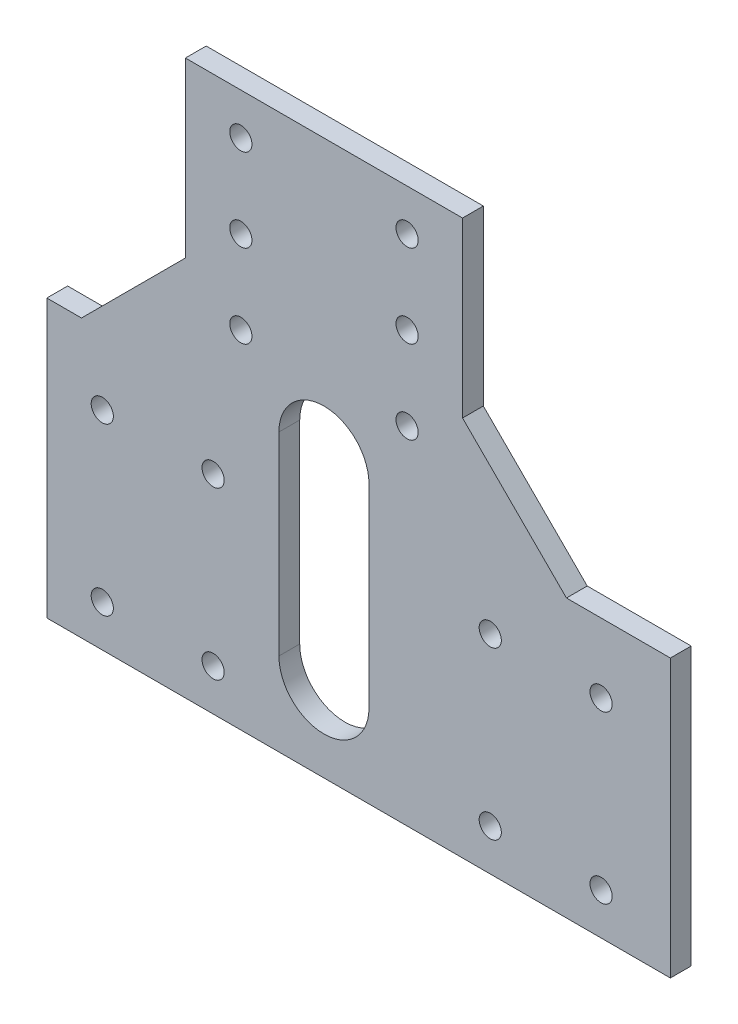
ISO-10303-21;
HEADER;
FILE_DESCRIPTION(('STEP AP214'),'2;1');
FILE_NAME('part.step','',(''),(''),'','','');
FILE_SCHEMA(('AUTOMOTIVE_DESIGN { 1 0 10303 214 1 1 1 1 }'));
ENDSEC;
DATA;
#1=APPLICATION_CONTEXT('core data for automotive mechanical design processes');
#2=APPLICATION_PROTOCOL_DEFINITION('international standard','automotive_design',2000,#1);
#3=PRODUCT_CONTEXT('',#1,'mechanical');
#4=PRODUCT('Part','Part','',(#3));
#5=PRODUCT_RELATED_PRODUCT_CATEGORY('part','',(#4));
#6=PRODUCT_DEFINITION_FORMATION('','',#4);
#7=PRODUCT_DEFINITION_CONTEXT('part definition',#1,'design');
#8=PRODUCT_DEFINITION('design','',#6,#7);
#9=PRODUCT_DEFINITION_SHAPE('','',#8);
#10=(LENGTH_UNIT() NAMED_UNIT(*) SI_UNIT(.MILLI.,.METRE.));
#11=(NAMED_UNIT(*) PLANE_ANGLE_UNIT() SI_UNIT($,.RADIAN.));
#12=(NAMED_UNIT(*) SI_UNIT($,.STERADIAN.) SOLID_ANGLE_UNIT());
#13=UNCERTAINTY_MEASURE_WITH_UNIT(LENGTH_MEASURE(1.E-05),#10,'distance_accuracy_value','');
#14=(GEOMETRIC_REPRESENTATION_CONTEXT(3) GLOBAL_UNCERTAINTY_ASSIGNED_CONTEXT((#13)) GLOBAL_UNIT_ASSIGNED_CONTEXT((#10,
#11,#12)) REPRESENTATION_CONTEXT('',''));
#15=CARTESIAN_POINT('',(0.,0.,0.));
#16=DIRECTION('',(0.,0.,1.));
#17=DIRECTION('',(1.,0.,0.));
#18=AXIS2_PLACEMENT_3D('',#15,#16,#17);
#19=CARTESIAN_POINT('',(0.,40.,3.));
#20=DIRECTION('',(0.,1.,0.));
#21=DIRECTION('',(0.,0.,1.));
#22=AXIS2_PLACEMENT_3D('',#19,#20,#21);
#23=PLANE('',#22);
#24=DIRECTION('',(1.,0.,0.));
#25=VECTOR('',#24,1.);
#26=CARTESIAN_POINT('',(0.,40.,0.));
#27=LINE('',#26,#25);
#28=CARTESIAN_POINT('',(74.9999999999998,40.,0.));
#29=VERTEX_POINT('',#28);
#30=CARTESIAN_POINT('',(90.,40.,0.));
#31=VERTEX_POINT('',#30);
#32=EDGE_CURVE('E252',#29,#31,#27,.T.);
#33=ORIENTED_EDGE('',*,*,#32,.F.);
#34=DIRECTION('',(0.,0.,-1.));
#35=VECTOR('',#34,1.);
#36=CARTESIAN_POINT('',(74.9999999999998,40.,3.));
#37=LINE('',#36,#35);
#38=CARTESIAN_POINT('',(74.9999999999998,40.,3.));
#39=VERTEX_POINT('',#38);
#40=EDGE_CURVE('E11',#39,#29,#37,.T.);
#41=ORIENTED_EDGE('',*,*,#40,.F.);
#42=DIRECTION('',(1.,0.,0.));
#43=VECTOR('',#42,1.);
#44=CARTESIAN_POINT('',(0.,40.,3.));
#45=LINE('',#44,#43);
#46=CARTESIAN_POINT('',(90.,40.,3.));
#47=VERTEX_POINT('',#46);
#48=EDGE_CURVE('E255',#39,#47,#45,.T.);
#49=ORIENTED_EDGE('',*,*,#48,.T.);
#50=DIRECTION('',(0.,0.,-1.));
#51=VECTOR('',#50,1.);
#52=CARTESIAN_POINT('',(90.,40.,3.));
#53=LINE('',#52,#51);
#54=EDGE_CURVE('E286',#47,#31,#53,.T.);
#55=ORIENTED_EDGE('',*,*,#54,.T.);
#56=EDGE_LOOP('',(#33,#41,#49,#55));
#57=FACE_BOUND('',#56,.T.);
#58=ADVANCED_FACE('F37',(#57),#23,.T.);
#59=CARTESIAN_POINT('',(57.5,57.4999999999998,3.));
#60=DIRECTION('',(0.707106781186549,0.707106781186546,0.));
#61=DIRECTION('',(-0.707106781186546,0.707106781186549,0.));
#62=AXIS2_PLACEMENT_3D('',#59,#60,#61);
#63=PLANE('',#62);
#64=DIRECTION('',(0.707106781186546,-0.707106781186549,0.));
#65=VECTOR('',#64,1.);
#66=CARTESIAN_POINT('',(57.5,57.4999999999998,0.));
#67=LINE('',#66,#65);
#68=CARTESIAN_POINT('',(60.,54.9999999999998,0.));
#69=VERTEX_POINT('',#68);
#70=EDGE_CURVE('E289',#69,#29,#67,.T.);
#71=ORIENTED_EDGE('',*,*,#70,.F.);
#72=DIRECTION('',(0.,0.,-1.));
#73=VECTOR('',#72,1.);
#74=CARTESIAN_POINT('',(60.,54.9999999999998,3.));
#75=LINE('',#74,#73);
#76=CARTESIAN_POINT('',(60.,54.9999999999998,3.));
#77=VERTEX_POINT('',#76);
#78=EDGE_CURVE('E44',#77,#69,#75,.T.);
#79=ORIENTED_EDGE('',*,*,#78,.F.);
#80=DIRECTION('',(0.707106781186546,-0.707106781186549,0.));
#81=VECTOR('',#80,1.);
#82=CARTESIAN_POINT('',(57.5,57.4999999999998,3.));
#83=LINE('',#82,#81);
#84=EDGE_CURVE('E258',#77,#39,#83,.T.);
#85=ORIENTED_EDGE('',*,*,#84,.T.);
#86=ORIENTED_EDGE('',*,*,#40,.T.);
#87=EDGE_LOOP('',(#71,#79,#85,#86));
#88=FACE_BOUND('',#87,.T.);
#89=ADVANCED_FACE('F336',(#88),#63,.T.);
#90=CARTESIAN_POINT('',(60.,0.,3.));
#91=DIRECTION('',(1.,0.,0.));
#92=DIRECTION('',(0.,1.,0.));
#93=AXIS2_PLACEMENT_3D('',#90,#91,#92);
#94=PLANE('',#93);
#95=DIRECTION('',(0.,-1.,0.));
#96=VECTOR('',#95,1.);
#97=CARTESIAN_POINT('',(60.,0.,0.));
#98=LINE('',#97,#96);
#99=CARTESIAN_POINT('',(60.,80.,0.));
#100=VERTEX_POINT('',#99);
#101=EDGE_CURVE('E292',#100,#69,#98,.T.);
#102=ORIENTED_EDGE('',*,*,#101,.F.);
#103=DIRECTION('',(0.,0.,-1.));
#104=VECTOR('',#103,1.);
#105=CARTESIAN_POINT('',(60.,80.,3.));
#106=LINE('',#105,#104);
#107=CARTESIAN_POINT('',(60.,80.,3.));
#108=VERTEX_POINT('',#107);
#109=EDGE_CURVE('E328',#108,#100,#106,.T.);
#110=ORIENTED_EDGE('',*,*,#109,.F.);
#111=DIRECTION('',(0.,-1.,0.));
#112=VECTOR('',#111,1.);
#113=CARTESIAN_POINT('',(60.,0.,3.));
#114=LINE('',#113,#112);
#115=EDGE_CURVE('E262',#108,#77,#114,.T.);
#116=ORIENTED_EDGE('',*,*,#115,.T.);
#117=ORIENTED_EDGE('',*,*,#78,.T.);
#118=EDGE_LOOP('',(#102,#110,#116,#117));
#119=FACE_BOUND('',#118,.T.);
#120=ADVANCED_FACE('F332',(#119),#94,.T.);
#121=CARTESIAN_POINT('',(0.,80.,3.));
#122=DIRECTION('',(0.,1.,0.));
#123=DIRECTION('',(-1.,0.,0.));
#124=AXIS2_PLACEMENT_3D('',#121,#122,#123);
#125=PLANE('',#124);
#126=DIRECTION('',(1.,0.,0.));
#127=VECTOR('',#126,1.);
#128=CARTESIAN_POINT('',(0.,80.,0.));
#129=LINE('',#128,#127);
#130=CARTESIAN_POINT('',(20.,80.,0.));
#131=VERTEX_POINT('',#130);
#132=EDGE_CURVE('E295',#131,#100,#129,.T.);
#133=ORIENTED_EDGE('',*,*,#132,.F.);
#134=DIRECTION('',(0.,0.,-1.));
#135=VECTOR('',#134,1.);
#136=CARTESIAN_POINT('',(20.,80.,3.));
#137=LINE('',#136,#135);
#138=CARTESIAN_POINT('',(20.,80.,3.));
#139=VERTEX_POINT('',#138);
#140=EDGE_CURVE('E326',#139,#131,#137,.T.);
#141=ORIENTED_EDGE('',*,*,#140,.F.);
#142=DIRECTION('',(1.,0.,0.));
#143=VECTOR('',#142,1.);
#144=CARTESIAN_POINT('',(0.,80.,3.));
#145=LINE('',#144,#143);
#146=EDGE_CURVE('E265',#139,#108,#145,.T.);
#147=ORIENTED_EDGE('',*,*,#146,.T.);
#148=ORIENTED_EDGE('',*,*,#109,.T.);
#149=EDGE_LOOP('',(#133,#141,#147,#148));
#150=FACE_BOUND('',#149,.T.);
#151=ADVANCED_FACE('F342',(#150),#125,.T.);
#152=CARTESIAN_POINT('',(20.,0.,3.));
#153=DIRECTION('',(-1.,0.,0.));
#154=DIRECTION('',(0.,0.,1.));
#155=AXIS2_PLACEMENT_3D('',#152,#153,#154);
#156=PLANE('',#155);
#157=DIRECTION('',(0.,1.,0.));
#158=VECTOR('',#157,1.);
#159=CARTESIAN_POINT('',(20.,0.,0.));
#160=LINE('',#159,#158);
#161=CARTESIAN_POINT('',(20.,54.9999999999998,0.));
#162=VERTEX_POINT('',#161);
#163=EDGE_CURVE('E298',#162,#131,#160,.T.);
#164=ORIENTED_EDGE('',*,*,#163,.F.);
#165=DIRECTION('',(0.,0.,-1.));
#166=VECTOR('',#165,1.);
#167=CARTESIAN_POINT('',(20.,54.9999999999998,3.));
#168=LINE('',#167,#166);
#169=CARTESIAN_POINT('',(20.,54.9999999999998,3.));
#170=VERTEX_POINT('',#169);
#171=EDGE_CURVE('E324',#170,#162,#168,.T.);
#172=ORIENTED_EDGE('',*,*,#171,.F.);
#173=DIRECTION('',(0.,1.,0.));
#174=VECTOR('',#173,1.);
#175=CARTESIAN_POINT('',(20.,0.,3.));
#176=LINE('',#175,#174);
#177=EDGE_CURVE('E268',#170,#139,#176,.T.);
#178=ORIENTED_EDGE('',*,*,#177,.T.);
#179=ORIENTED_EDGE('',*,*,#140,.T.);
#180=EDGE_LOOP('',(#164,#172,#178,#179));
#181=FACE_BOUND('',#180,.T.);
#182=ADVANCED_FACE('F370',(#181),#156,.T.);
#183=CARTESIAN_POINT('',(-17.5,17.5000000000002,3.));
#184=DIRECTION('',(-0.707106781186544,0.707106781186551,0.));
#185=DIRECTION('',(-0.707106781186551,-0.707106781186544,0.));
#186=AXIS2_PLACEMENT_3D('',#183,#184,#185);
#187=PLANE('',#186);
#188=DIRECTION('',(0.707106781186551,0.707106781186544,0.));
#189=VECTOR('',#188,1.);
#190=CARTESIAN_POINT('',(-17.5,17.5000000000002,0.));
#191=LINE('',#190,#189);
#192=CARTESIAN_POINT('',(5.,40.,0.));
#193=VERTEX_POINT('',#192);
#194=EDGE_CURVE('E301',#193,#162,#191,.T.);
#195=ORIENTED_EDGE('',*,*,#194,.F.);
#196=DIRECTION('',(0.,0.,-1.));
#197=VECTOR('',#196,1.);
#198=CARTESIAN_POINT('',(5.,40.,3.));
#199=LINE('',#198,#197);
#200=CARTESIAN_POINT('',(5.,40.,3.));
#201=VERTEX_POINT('',#200);
#202=EDGE_CURVE('E322',#201,#193,#199,.T.);
#203=ORIENTED_EDGE('',*,*,#202,.F.);
#204=DIRECTION('',(0.707106781186551,0.707106781186544,0.));
#205=VECTOR('',#204,1.);
#206=CARTESIAN_POINT('',(-17.5,17.5000000000002,3.));
#207=LINE('',#206,#205);
#208=EDGE_CURVE('E271',#201,#170,#207,.T.);
#209=ORIENTED_EDGE('',*,*,#208,.T.);
#210=ORIENTED_EDGE('',*,*,#171,.T.);
#211=EDGE_LOOP('',(#195,#203,#209,#210));
#212=FACE_BOUND('',#211,.T.);
#213=ADVANCED_FACE('F368',(#212),#187,.T.);
#214=CARTESIAN_POINT('',(0.,40.,3.));
#215=DIRECTION('',(0.,1.,0.));
#216=DIRECTION('',(0.,0.,1.));
#217=AXIS2_PLACEMENT_3D('',#214,#215,#216);
#218=PLANE('',#217);
#219=DIRECTION('',(1.,0.,0.));
#220=VECTOR('',#219,1.);
#221=CARTESIAN_POINT('',(0.,40.,0.));
#222=LINE('',#221,#220);
#223=CARTESIAN_POINT('',(0.,40.,0.));
#224=VERTEX_POINT('',#223);
#225=EDGE_CURVE('E304',#224,#193,#222,.T.);
#226=ORIENTED_EDGE('',*,*,#225,.F.);
#227=DIRECTION('',(0.,0.,-1.));
#228=VECTOR('',#227,1.);
#229=CARTESIAN_POINT('',(0.,40.,3.));
#230=LINE('',#229,#228);
#231=CARTESIAN_POINT('',(0.,40.,3.));
#232=VERTEX_POINT('',#231);
#233=EDGE_CURVE('E320',#232,#224,#230,.T.);
#234=ORIENTED_EDGE('',*,*,#233,.F.);
#235=DIRECTION('',(1.,0.,0.));
#236=VECTOR('',#235,1.);
#237=CARTESIAN_POINT('',(0.,40.,3.));
#238=LINE('',#237,#236);
#239=EDGE_CURVE('E274',#232,#201,#238,.T.);
#240=ORIENTED_EDGE('',*,*,#239,.T.);
#241=ORIENTED_EDGE('',*,*,#202,.T.);
#242=EDGE_LOOP('',(#226,#234,#240,#241));
#243=FACE_BOUND('',#242,.T.);
#244=ADVANCED_FACE('F364',(#243),#218,.T.);
#245=CARTESIAN_POINT('',(0.,0.,3.));
#246=DIRECTION('',(-1.,0.,0.));
#247=DIRECTION('',(0.,0.,1.));
#248=AXIS2_PLACEMENT_3D('',#245,#246,#247);
#249=PLANE('',#248);
#250=DIRECTION('',(0.,1.,0.));
#251=VECTOR('',#250,1.);
#252=CARTESIAN_POINT('',(0.,0.,0.));
#253=LINE('',#252,#251);
#254=CARTESIAN_POINT('',(0.,0.,0.));
#255=VERTEX_POINT('',#254);
#256=EDGE_CURVE('E307',#255,#224,#253,.T.);
#257=ORIENTED_EDGE('',*,*,#256,.F.);
#258=DIRECTION('',(0.,0.,-1.));
#259=VECTOR('',#258,1.);
#260=CARTESIAN_POINT('',(0.,0.,3.));
#261=LINE('',#260,#259);
#262=CARTESIAN_POINT('',(0.,0.,3.));
#263=VERTEX_POINT('',#262);
#264=EDGE_CURVE('E318',#263,#255,#261,.T.);
#265=ORIENTED_EDGE('',*,*,#264,.F.);
#266=DIRECTION('',(0.,1.,0.));
#267=VECTOR('',#266,1.);
#268=CARTESIAN_POINT('',(0.,0.,3.));
#269=LINE('',#268,#267);
#270=EDGE_CURVE('E277',#263,#232,#269,.T.);
#271=ORIENTED_EDGE('',*,*,#270,.T.);
#272=ORIENTED_EDGE('',*,*,#233,.T.);
#273=EDGE_LOOP('',(#257,#265,#271,#272));
#274=FACE_BOUND('',#273,.T.);
#275=ADVANCED_FACE('F360',(#274),#249,.T.);
#276=CARTESIAN_POINT('',(0.,0.,3.));
#277=DIRECTION('',(0.,-1.,0.));
#278=DIRECTION('',(1.,0.,0.));
#279=AXIS2_PLACEMENT_3D('',#276,#277,#278);
#280=PLANE('',#279);
#281=DIRECTION('',(-1.,0.,0.));
#282=VECTOR('',#281,1.);
#283=CARTESIAN_POINT('',(0.,0.,0.));
#284=LINE('',#283,#282);
#285=CARTESIAN_POINT('',(90.,0.,0.));
#286=VERTEX_POINT('',#285);
#287=EDGE_CURVE('E310',#286,#255,#284,.T.);
#288=ORIENTED_EDGE('',*,*,#287,.F.);
#289=DIRECTION('',(0.,0.,-1.));
#290=VECTOR('',#289,1.);
#291=CARTESIAN_POINT('',(90.,0.,3.));
#292=LINE('',#291,#290);
#293=CARTESIAN_POINT('',(90.,0.,3.));
#294=VERTEX_POINT('',#293);
#295=EDGE_CURVE('E316',#294,#286,#292,.T.);
#296=ORIENTED_EDGE('',*,*,#295,.F.);
#297=DIRECTION('',(-1.,0.,0.));
#298=VECTOR('',#297,1.);
#299=CARTESIAN_POINT('',(0.,0.,3.));
#300=LINE('',#299,#298);
#301=EDGE_CURVE('E280',#294,#263,#300,.T.);
#302=ORIENTED_EDGE('',*,*,#301,.T.);
#303=ORIENTED_EDGE('',*,*,#264,.T.);
#304=EDGE_LOOP('',(#288,#296,#302,#303));
#305=FACE_BOUND('',#304,.T.);
#306=ADVANCED_FACE('F356',(#305),#280,.T.);
#307=CARTESIAN_POINT('',(90.,0.,3.));
#308=DIRECTION('',(1.,0.,0.));
#309=DIRECTION('',(0.,0.,-1.));
#310=AXIS2_PLACEMENT_3D('',#307,#308,#309);
#311=PLANE('',#310);
#312=DIRECTION('',(0.,-1.,0.));
#313=VECTOR('',#312,1.);
#314=CARTESIAN_POINT('',(90.,0.,0.));
#315=LINE('',#314,#313);
#316=EDGE_CURVE('E259',#31,#286,#315,.T.);
#317=ORIENTED_EDGE('',*,*,#316,.F.);
#318=ORIENTED_EDGE('',*,*,#54,.F.);
#319=DIRECTION('',(0.,-1.,0.));
#320=VECTOR('',#319,1.);
#321=CARTESIAN_POINT('',(90.,0.,3.));
#322=LINE('',#321,#320);
#323=EDGE_CURVE('E283',#47,#294,#322,.T.);
#324=ORIENTED_EDGE('',*,*,#323,.T.);
#325=ORIENTED_EDGE('',*,*,#295,.T.);
#326=EDGE_LOOP('',(#317,#318,#324,#325));
#327=FACE_BOUND('',#326,.T.);
#328=ADVANCED_FACE('F353',(#327),#311,.T.);
#329=CARTESIAN_POINT('',(0.,0.,3.));
#330=DIRECTION('',(0.,0.,1.));
#331=DIRECTION('',(1.,0.,0.));
#332=AXIS2_PLACEMENT_3D('',#329,#330,#331);
#333=PLANE('',#332);
#334=CARTESIAN_POINT('',(24.,30.,3.));
#335=DIRECTION('',(0.,0.,1.));
#336=DIRECTION('',(1.,0.,0.));
#337=AXIS2_PLACEMENT_3D('',#334,#335,#336);
#338=CIRCLE('',#337,1.6);
#339=CARTESIAN_POINT('',(25.6,30.,3.));
#340=VERTEX_POINT('',#339);
#341=EDGE_CURVE('E217',#340,#340,#338,.T.);
#342=ORIENTED_EDGE('',*,*,#341,.F.);
#343=EDGE_LOOP('',(#342));
#344=FACE_BOUND('',#343,.T.);
#345=CARTESIAN_POINT('',(80.,30.,3.));
#346=DIRECTION('',(0.,0.,1.));
#347=DIRECTION('',(1.,0.,0.));
#348=AXIS2_PLACEMENT_3D('',#345,#346,#347);
#349=CIRCLE('',#348,1.6);
#350=CARTESIAN_POINT('',(81.6,30.,3.));
#351=VERTEX_POINT('',#350);
#352=EDGE_CURVE('E204',#351,#351,#349,.T.);
#353=ORIENTED_EDGE('',*,*,#352,.F.);
#354=EDGE_LOOP('',(#353));
#355=FACE_BOUND('',#354,.T.);
#356=CARTESIAN_POINT('',(64.,30.,3.));
#357=DIRECTION('',(0.,0.,1.));
#358=DIRECTION('',(1.,0.,0.));
#359=AXIS2_PLACEMENT_3D('',#356,#357,#358);
#360=CIRCLE('',#359,1.6);
#361=CARTESIAN_POINT('',(65.6,30.,3.));
#362=VERTEX_POINT('',#361);
#363=EDGE_CURVE('E205',#362,#362,#360,.T.);
#364=ORIENTED_EDGE('',*,*,#363,.F.);
#365=EDGE_LOOP('',(#364));
#366=FACE_BOUND('',#365,.T.);
#367=CARTESIAN_POINT('',(80.,6.,3.));
#368=DIRECTION('',(0.,0.,1.));
#369=DIRECTION('',(1.,0.,0.));
#370=AXIS2_PLACEMENT_3D('',#367,#368,#369);
#371=CIRCLE('',#370,1.60000000000001);
#372=CARTESIAN_POINT('',(81.6,6.,3.));
#373=VERTEX_POINT('',#372);
#374=EDGE_CURVE('E179',#373,#373,#371,.T.);
#375=ORIENTED_EDGE('',*,*,#374,.F.);
#376=EDGE_LOOP('',(#375));
#377=FACE_BOUND('',#376,.T.);
#378=CARTESIAN_POINT('',(52.,74.,3.));
#379=DIRECTION('',(0.,0.,1.));
#380=DIRECTION('',(1.,0.,0.));
#381=AXIS2_PLACEMENT_3D('',#378,#379,#380);
#382=CIRCLE('',#381,1.6);
#383=CARTESIAN_POINT('',(53.6,74.,3.));
#384=VERTEX_POINT('',#383);
#385=EDGE_CURVE('E241',#384,#384,#382,.T.);
#386=ORIENTED_EDGE('',*,*,#385,.F.);
#387=EDGE_LOOP('',(#386));
#388=FACE_BOUND('',#387,.T.);
#389=CARTESIAN_POINT('',(28.,50.,3.));
#390=DIRECTION('',(0.,0.,1.));
#391=DIRECTION('',(1.,0.,0.));
#392=AXIS2_PLACEMENT_3D('',#389,#390,#391);
#393=CIRCLE('',#392,1.6);
#394=CARTESIAN_POINT('',(29.6,50.,3.));
#395=VERTEX_POINT('',#394);
#396=EDGE_CURVE('E228',#395,#395,#393,.T.);
#397=ORIENTED_EDGE('',*,*,#396,.F.);
#398=EDGE_LOOP('',(#397));
#399=FACE_BOUND('',#398,.T.);
#400=CARTESIAN_POINT('',(52.,50.,3.));
#401=DIRECTION('',(0.,0.,1.));
#402=DIRECTION('',(1.,0.,0.));
#403=AXIS2_PLACEMENT_3D('',#400,#401,#402);
#404=CIRCLE('',#403,1.6);
#405=CARTESIAN_POINT('',(53.6,50.,3.));
#406=VERTEX_POINT('',#405);
#407=EDGE_CURVE('E229',#406,#406,#404,.T.);
#408=ORIENTED_EDGE('',*,*,#407,.F.);
#409=EDGE_LOOP('',(#408));
#410=FACE_BOUND('',#409,.T.);
#411=CARTESIAN_POINT('',(8.,30.,3.));
#412=DIRECTION('',(0.,0.,1.));
#413=DIRECTION('',(1.,0.,0.));
#414=AXIS2_PLACEMENT_3D('',#411,#412,#413);
#415=CIRCLE('',#414,1.6);
#416=CARTESIAN_POINT('',(9.6,30.,3.));
#417=VERTEX_POINT('',#416);
#418=EDGE_CURVE('E216',#417,#417,#415,.T.);
#419=ORIENTED_EDGE('',*,*,#418,.F.);
#420=EDGE_LOOP('',(#419));
#421=FACE_BOUND('',#420,.T.);
#422=CARTESIAN_POINT('',(40.,40.,3.));
#423=DIRECTION('',(0.,0.,1.));
#424=DIRECTION('',(1.,0.,0.));
#425=AXIS2_PLACEMENT_3D('',#422,#423,#424);
#426=CIRCLE('',#425,6.50000000000001);
#427=CARTESIAN_POINT('',(46.5,40.,3.));
#428=VERTEX_POINT('',#427);
#429=CARTESIAN_POINT('',(33.5,40.,3.));
#430=VERTEX_POINT('',#429);
#431=EDGE_CURVE('E51',#428,#430,#426,.T.);
#432=ORIENTED_EDGE('',*,*,#431,.F.);
#433=DIRECTION('',(0.,1.,0.));
#434=VECTOR('',#433,1.);
#435=CARTESIAN_POINT('',(46.5,40.,3.));
#436=LINE('',#435,#434);
#437=CARTESIAN_POINT('',(46.5,12.,3.));
#438=VERTEX_POINT('',#437);
#439=EDGE_CURVE('E154',#438,#428,#436,.T.);
#440=ORIENTED_EDGE('',*,*,#439,.F.);
#441=CARTESIAN_POINT('',(40.,12.,3.));
#442=DIRECTION('',(0.,0.,1.));
#443=DIRECTION('',(1.,0.,0.));
#444=AXIS2_PLACEMENT_3D('',#441,#442,#443);
#445=CIRCLE('',#444,6.50000000000001);
#446=CARTESIAN_POINT('',(33.5,12.,3.));
#447=VERTEX_POINT('',#446);
#448=EDGE_CURVE('E157',#447,#438,#445,.T.);
#449=ORIENTED_EDGE('',*,*,#448,.F.);
#450=DIRECTION('',(0.,-1.,0.));
#451=VECTOR('',#450,1.);
#452=CARTESIAN_POINT('',(33.5,40.,3.));
#453=LINE('',#452,#451);
#454=EDGE_CURVE('E166',#430,#447,#453,.T.);
#455=ORIENTED_EDGE('',*,*,#454,.F.);
#456=EDGE_LOOP('',(#432,#440,#449,#455));
#457=FACE_BOUND('',#456,.T.);
#458=CARTESIAN_POINT('',(8.,5.99999999999999,3.));
#459=DIRECTION('',(0.,0.,1.));
#460=DIRECTION('',(1.,0.,0.));
#461=AXIS2_PLACEMENT_3D('',#458,#459,#460);
#462=CIRCLE('',#461,1.6);
#463=CARTESIAN_POINT('',(9.6,5.99999999999999,3.));
#464=VERTEX_POINT('',#463);
#465=EDGE_CURVE('E160',#464,#464,#462,.T.);
#466=ORIENTED_EDGE('',*,*,#465,.F.);
#467=EDGE_LOOP('',(#466));
#468=FACE_BOUND('',#467,.T.);
#469=CARTESIAN_POINT('',(24.,5.99999999999999,3.));
#470=DIRECTION('',(0.,0.,1.));
#471=DIRECTION('',(1.,0.,0.));
#472=AXIS2_PLACEMENT_3D('',#469,#470,#471);
#473=CIRCLE('',#472,1.6);
#474=CARTESIAN_POINT('',(25.6,5.99999999999999,3.));
#475=VERTEX_POINT('',#474);
#476=EDGE_CURVE('E186',#475,#475,#473,.T.);
#477=ORIENTED_EDGE('',*,*,#476,.F.);
#478=EDGE_LOOP('',(#477));
#479=FACE_BOUND('',#478,.T.);
#480=CARTESIAN_POINT('',(64.,6.,3.));
#481=DIRECTION('',(0.,0.,1.));
#482=DIRECTION('',(1.,0.,0.));
#483=AXIS2_PLACEMENT_3D('',#480,#481,#482);
#484=CIRCLE('',#483,1.60000000000001);
#485=CARTESIAN_POINT('',(65.6,6.,3.));
#486=VERTEX_POINT('',#485);
#487=EDGE_CURVE('E180',#486,#486,#484,.T.);
#488=ORIENTED_EDGE('',*,*,#487,.F.);
#489=EDGE_LOOP('',(#488));
#490=FACE_BOUND('',#489,.T.);
#491=CARTESIAN_POINT('',(28.,62.,3.));
#492=DIRECTION('',(0.,0.,1.));
#493=DIRECTION('',(1.,0.,0.));
#494=AXIS2_PLACEMENT_3D('',#491,#492,#493);
#495=CIRCLE('',#494,1.6);
#496=CARTESIAN_POINT('',(29.6,62.,3.));
#497=VERTEX_POINT('',#496);
#498=EDGE_CURVE('E192',#497,#497,#495,.T.);
#499=ORIENTED_EDGE('',*,*,#498,.F.);
#500=EDGE_LOOP('',(#499));
#501=FACE_BOUND('',#500,.T.);
#502=CARTESIAN_POINT('',(52.,62.,3.));
#503=DIRECTION('',(0.,0.,1.));
#504=DIRECTION('',(1.,0.,0.));
#505=AXIS2_PLACEMENT_3D('',#502,#503,#504);
#506=CIRCLE('',#505,1.6);
#507=CARTESIAN_POINT('',(53.6,62.,3.));
#508=VERTEX_POINT('',#507);
#509=EDGE_CURVE('E198',#508,#508,#506,.T.);
#510=ORIENTED_EDGE('',*,*,#509,.F.);
#511=EDGE_LOOP('',(#510));
#512=FACE_BOUND('',#511,.T.);
#513=CARTESIAN_POINT('',(28.,74.,3.));
#514=DIRECTION('',(0.,0.,1.));
#515=DIRECTION('',(1.,0.,0.));
#516=AXIS2_PLACEMENT_3D('',#513,#514,#515);
#517=CIRCLE('',#516,1.6);
#518=CARTESIAN_POINT('',(29.6,74.,3.));
#519=VERTEX_POINT('',#518);
#520=EDGE_CURVE('E240',#519,#519,#517,.T.);
#521=ORIENTED_EDGE('',*,*,#520,.F.);
#522=EDGE_LOOP('',(#521));
#523=FACE_BOUND('',#522,.T.);
#524=ORIENTED_EDGE('',*,*,#48,.F.);
#525=ORIENTED_EDGE('',*,*,#84,.F.);
#526=ORIENTED_EDGE('',*,*,#115,.F.);
#527=ORIENTED_EDGE('',*,*,#146,.F.);
#528=ORIENTED_EDGE('',*,*,#177,.F.);
#529=ORIENTED_EDGE('',*,*,#208,.F.);
#530=ORIENTED_EDGE('',*,*,#239,.F.);
#531=ORIENTED_EDGE('',*,*,#270,.F.);
#532=ORIENTED_EDGE('',*,*,#301,.F.);
#533=ORIENTED_EDGE('',*,*,#323,.F.);
#534=EDGE_LOOP('',(#524,#525,#526,#527,#528,#529,#530,#531,#532,#533));
#535=FACE_BOUND('',#534,.T.);
#536=ADVANCED_FACE('F346',(#344,#355,#366,#377,#388,#399,#410,#421,#457,#468,#479,#490,#501,
#512,#523,#535),#333,.T.);
#537=CARTESIAN_POINT('',(0.,0.,0.));
#538=DIRECTION('',(0.,0.,1.));
#539=DIRECTION('',(1.,0.,0.));
#540=AXIS2_PLACEMENT_3D('',#537,#538,#539);
#541=PLANE('',#540);
#542=CARTESIAN_POINT('',(24.,30.,0.));
#543=DIRECTION('',(0.,0.,1.));
#544=DIRECTION('',(1.,0.,0.));
#545=AXIS2_PLACEMENT_3D('',#542,#543,#544);
#546=CIRCLE('',#545,1.6);
#547=CARTESIAN_POINT('',(25.6,30.,0.));
#548=VERTEX_POINT('',#547);
#549=EDGE_CURVE('E213',#548,#548,#546,.T.);
#550=ORIENTED_EDGE('',*,*,#549,.T.);
#551=EDGE_LOOP('',(#550));
#552=FACE_BOUND('',#551,.T.);
#553=CARTESIAN_POINT('',(80.,30.,0.));
#554=DIRECTION('',(0.,0.,1.));
#555=DIRECTION('',(1.,0.,0.));
#556=AXIS2_PLACEMENT_3D('',#553,#554,#555);
#557=CIRCLE('',#556,1.6);
#558=CARTESIAN_POINT('',(81.6,30.,0.));
#559=VERTEX_POINT('',#558);
#560=EDGE_CURVE('E220',#559,#559,#557,.T.);
#561=ORIENTED_EDGE('',*,*,#560,.T.);
#562=EDGE_LOOP('',(#561));
#563=FACE_BOUND('',#562,.T.);
#564=CARTESIAN_POINT('',(64.,30.,0.));
#565=DIRECTION('',(0.,0.,1.));
#566=DIRECTION('',(1.,0.,0.));
#567=AXIS2_PLACEMENT_3D('',#564,#565,#566);
#568=CIRCLE('',#567,1.6);
#569=CARTESIAN_POINT('',(65.6,30.,0.));
#570=VERTEX_POINT('',#569);
#571=EDGE_CURVE('E201',#570,#570,#568,.T.);
#572=ORIENTED_EDGE('',*,*,#571,.T.);
#573=EDGE_LOOP('',(#572));
#574=FACE_BOUND('',#573,.T.);
#575=CARTESIAN_POINT('',(80.,6.,0.));
#576=DIRECTION('',(0.,0.,1.));
#577=DIRECTION('',(1.,0.,0.));
#578=AXIS2_PLACEMENT_3D('',#575,#576,#577);
#579=CIRCLE('',#578,1.60000000000001);
#580=CARTESIAN_POINT('',(81.6,6.,0.));
#581=VERTEX_POINT('',#580);
#582=EDGE_CURVE('E208',#581,#581,#579,.T.);
#583=ORIENTED_EDGE('',*,*,#582,.T.);
#584=EDGE_LOOP('',(#583));
#585=FACE_BOUND('',#584,.T.);
#586=CARTESIAN_POINT('',(52.,74.,0.));
#587=DIRECTION('',(0.,0.,1.));
#588=DIRECTION('',(1.,0.,0.));
#589=AXIS2_PLACEMENT_3D('',#586,#587,#588);
#590=CIRCLE('',#589,1.6);
#591=CARTESIAN_POINT('',(53.6,74.,0.));
#592=VERTEX_POINT('',#591);
#593=EDGE_CURVE('E237',#592,#592,#590,.T.);
#594=ORIENTED_EDGE('',*,*,#593,.T.);
#595=EDGE_LOOP('',(#594));
#596=FACE_BOUND('',#595,.T.);
#597=CARTESIAN_POINT('',(28.,50.,0.));
#598=DIRECTION('',(0.,0.,1.));
#599=DIRECTION('',(1.,0.,0.));
#600=AXIS2_PLACEMENT_3D('',#597,#598,#599);
#601=CIRCLE('',#600,1.6);
#602=CARTESIAN_POINT('',(29.6,50.,0.));
#603=VERTEX_POINT('',#602);
#604=EDGE_CURVE('E244',#603,#603,#601,.T.);
#605=ORIENTED_EDGE('',*,*,#604,.T.);
#606=EDGE_LOOP('',(#605));
#607=FACE_BOUND('',#606,.T.);
#608=CARTESIAN_POINT('',(52.,50.,0.));
#609=DIRECTION('',(0.,0.,1.));
#610=DIRECTION('',(1.,0.,0.));
#611=AXIS2_PLACEMENT_3D('',#608,#609,#610);
#612=CIRCLE('',#611,1.6);
#613=CARTESIAN_POINT('',(53.6,50.,0.));
#614=VERTEX_POINT('',#613);
#615=EDGE_CURVE('E225',#614,#614,#612,.T.);
#616=ORIENTED_EDGE('',*,*,#615,.T.);
#617=EDGE_LOOP('',(#616));
#618=FACE_BOUND('',#617,.T.);
#619=CARTESIAN_POINT('',(8.,30.,0.));
#620=DIRECTION('',(0.,0.,1.));
#621=DIRECTION('',(1.,0.,0.));
#622=AXIS2_PLACEMENT_3D('',#619,#620,#621);
#623=CIRCLE('',#622,1.6);
#624=CARTESIAN_POINT('',(9.6,30.,0.));
#625=VERTEX_POINT('',#624);
#626=EDGE_CURVE('E232',#625,#625,#623,.T.);
#627=ORIENTED_EDGE('',*,*,#626,.T.);
#628=EDGE_LOOP('',(#627));
#629=FACE_BOUND('',#628,.T.);
#630=DIRECTION('',(0.,1.,0.));
#631=VECTOR('',#630,1.);
#632=CARTESIAN_POINT('',(46.5,40.,0.));
#633=LINE('',#632,#631);
#634=CARTESIAN_POINT('',(46.5,12.,0.));
#635=VERTEX_POINT('',#634);
#636=CARTESIAN_POINT('',(46.5,40.,0.));
#637=VERTEX_POINT('',#636);
#638=EDGE_CURVE('E144',#635,#637,#633,.T.);
#639=ORIENTED_EDGE('',*,*,#638,.T.);
#640=CARTESIAN_POINT('',(40.,40.,0.));
#641=DIRECTION('',(0.,0.,1.));
#642=DIRECTION('',(1.,0.,0.));
#643=AXIS2_PLACEMENT_3D('',#640,#641,#642);
#644=CIRCLE('',#643,6.50000000000001);
#645=CARTESIAN_POINT('',(33.5,40.,0.));
#646=VERTEX_POINT('',#645);
#647=EDGE_CURVE('E138',#637,#646,#644,.T.);
#648=ORIENTED_EDGE('',*,*,#647,.T.);
#649=DIRECTION('',(0.,-1.,0.));
#650=VECTOR('',#649,1.);
#651=CARTESIAN_POINT('',(33.5,40.,0.));
#652=LINE('',#651,#650);
#653=CARTESIAN_POINT('',(33.5,12.,0.));
#654=VERTEX_POINT('',#653);
#655=EDGE_CURVE('E147',#646,#654,#652,.T.);
#656=ORIENTED_EDGE('',*,*,#655,.T.);
#657=CARTESIAN_POINT('',(40.,12.,0.));
#658=DIRECTION('',(0.,0.,1.));
#659=DIRECTION('',(1.,0.,0.));
#660=AXIS2_PLACEMENT_3D('',#657,#658,#659);
#661=CIRCLE('',#660,6.50000000000001);
#662=EDGE_CURVE('E59',#654,#635,#661,.T.);
#663=ORIENTED_EDGE('',*,*,#662,.T.);
#664=EDGE_LOOP('',(#639,#648,#656,#663));
#665=FACE_BOUND('',#664,.T.);
#666=CARTESIAN_POINT('',(8.,5.99999999999999,0.));
#667=DIRECTION('',(0.,0.,1.));
#668=DIRECTION('',(1.,0.,0.));
#669=AXIS2_PLACEMENT_3D('',#666,#667,#668);
#670=CIRCLE('',#669,1.6);
#671=CARTESIAN_POINT('',(9.6,5.99999999999999,0.));
#672=VERTEX_POINT('',#671);
#673=EDGE_CURVE('E189',#672,#672,#670,.T.);
#674=ORIENTED_EDGE('',*,*,#673,.T.);
#675=EDGE_LOOP('',(#674));
#676=FACE_BOUND('',#675,.T.);
#677=CARTESIAN_POINT('',(24.,5.99999999999999,0.));
#678=DIRECTION('',(0.,0.,1.));
#679=DIRECTION('',(1.,0.,0.));
#680=AXIS2_PLACEMENT_3D('',#677,#678,#679);
#681=CIRCLE('',#680,1.6);
#682=CARTESIAN_POINT('',(25.6,5.99999999999999,0.));
#683=VERTEX_POINT('',#682);
#684=EDGE_CURVE('E183',#683,#683,#681,.T.);
#685=ORIENTED_EDGE('',*,*,#684,.T.);
#686=EDGE_LOOP('',(#685));
#687=FACE_BOUND('',#686,.T.);
#688=CARTESIAN_POINT('',(64.,6.,0.));
#689=DIRECTION('',(0.,0.,1.));
#690=DIRECTION('',(1.,0.,0.));
#691=AXIS2_PLACEMENT_3D('',#688,#689,#690);
#692=CIRCLE('',#691,1.60000000000001);
#693=CARTESIAN_POINT('',(65.6,6.,0.));
#694=VERTEX_POINT('',#693);
#695=EDGE_CURVE('E176',#694,#694,#692,.T.);
#696=ORIENTED_EDGE('',*,*,#695,.T.);
#697=EDGE_LOOP('',(#696));
#698=FACE_BOUND('',#697,.T.);
#699=CARTESIAN_POINT('',(28.,62.,0.));
#700=DIRECTION('',(0.,0.,1.));
#701=DIRECTION('',(1.,0.,0.));
#702=AXIS2_PLACEMENT_3D('',#699,#700,#701);
#703=CIRCLE('',#702,1.6);
#704=CARTESIAN_POINT('',(29.6,62.,0.));
#705=VERTEX_POINT('',#704);
#706=EDGE_CURVE('E167',#705,#705,#703,.T.);
#707=ORIENTED_EDGE('',*,*,#706,.T.);
#708=EDGE_LOOP('',(#707));
#709=FACE_BOUND('',#708,.T.);
#710=CARTESIAN_POINT('',(52.,62.,0.));
#711=DIRECTION('',(0.,0.,1.));
#712=DIRECTION('',(1.,0.,0.));
#713=AXIS2_PLACEMENT_3D('',#710,#711,#712);
#714=CIRCLE('',#713,1.6);
#715=CARTESIAN_POINT('',(53.6,62.,0.));
#716=VERTEX_POINT('',#715);
#717=EDGE_CURVE('E195',#716,#716,#714,.T.);
#718=ORIENTED_EDGE('',*,*,#717,.T.);
#719=EDGE_LOOP('',(#718));
#720=FACE_BOUND('',#719,.T.);
#721=CARTESIAN_POINT('',(28.,74.,0.));
#722=DIRECTION('',(0.,0.,1.));
#723=DIRECTION('',(1.,0.,0.));
#724=AXIS2_PLACEMENT_3D('',#721,#722,#723);
#725=CIRCLE('',#724,1.6);
#726=CARTESIAN_POINT('',(29.6,74.,0.));
#727=VERTEX_POINT('',#726);
#728=EDGE_CURVE('E249',#727,#727,#725,.T.);
#729=ORIENTED_EDGE('',*,*,#728,.T.);
#730=EDGE_LOOP('',(#729));
#731=FACE_BOUND('',#730,.T.);
#732=ORIENTED_EDGE('',*,*,#32,.T.);
#733=ORIENTED_EDGE('',*,*,#316,.T.);
#734=ORIENTED_EDGE('',*,*,#287,.T.);
#735=ORIENTED_EDGE('',*,*,#256,.T.);
#736=ORIENTED_EDGE('',*,*,#225,.T.);
#737=ORIENTED_EDGE('',*,*,#194,.T.);
#738=ORIENTED_EDGE('',*,*,#163,.T.);
#739=ORIENTED_EDGE('',*,*,#132,.T.);
#740=ORIENTED_EDGE('',*,*,#101,.T.);
#741=ORIENTED_EDGE('',*,*,#70,.T.);
#742=EDGE_LOOP('',(#732,#733,#734,#735,#736,#737,#738,#739,#740,#741));
#743=FACE_BOUND('',#742,.T.);
#744=ADVANCED_FACE('F151',(#552,#563,#574,#585,#596,#607,#618,#629,#665,#676,#687,#698,#709,
#720,#731,#743),#541,.F.);
#745=CARTESIAN_POINT('',(28.,74.,0.));
#746=DIRECTION('',(0.,0.,1.));
#747=DIRECTION('',(1.,0.,0.));
#748=AXIS2_PLACEMENT_3D('',#745,#746,#747);
#749=CYLINDRICAL_SURFACE('',#748,1.6);
#750=ORIENTED_EDGE('',*,*,#728,.F.);
#751=EDGE_LOOP('',(#750));
#752=FACE_BOUND('',#751,.T.);
#753=ORIENTED_EDGE('',*,*,#520,.T.);
#754=EDGE_LOOP('',(#753));
#755=FACE_BOUND('',#754,.T.);
#756=ADVANCED_FACE('F453',(#752,#755),#749,.F.);
#757=CARTESIAN_POINT('',(52.,62.,0.));
#758=DIRECTION('',(0.,0.,1.));
#759=DIRECTION('',(1.,0.,0.));
#760=AXIS2_PLACEMENT_3D('',#757,#758,#759);
#761=CYLINDRICAL_SURFACE('',#760,1.6);
#762=ORIENTED_EDGE('',*,*,#717,.F.);
#763=EDGE_LOOP('',(#762));
#764=FACE_BOUND('',#763,.T.);
#765=ORIENTED_EDGE('',*,*,#509,.T.);
#766=EDGE_LOOP('',(#765));
#767=FACE_BOUND('',#766,.T.);
#768=ADVANCED_FACE('F463',(#764,#767),#761,.F.);
#769=CARTESIAN_POINT('',(28.,62.,0.));
#770=DIRECTION('',(0.,0.,1.));
#771=DIRECTION('',(1.,0.,0.));
#772=AXIS2_PLACEMENT_3D('',#769,#770,#771);
#773=CYLINDRICAL_SURFACE('',#772,1.6);
#774=ORIENTED_EDGE('',*,*,#706,.F.);
#775=EDGE_LOOP('',(#774));
#776=FACE_BOUND('',#775,.T.);
#777=ORIENTED_EDGE('',*,*,#498,.T.);
#778=EDGE_LOOP('',(#777));
#779=FACE_BOUND('',#778,.T.);
#780=ADVANCED_FACE('F473',(#776,#779),#773,.F.);
#781=CARTESIAN_POINT('',(64.,6.,0.));
#782=DIRECTION('',(0.,0.,1.));
#783=DIRECTION('',(1.,0.,0.));
#784=AXIS2_PLACEMENT_3D('',#781,#782,#783);
#785=CYLINDRICAL_SURFACE('',#784,1.60000000000001);
#786=ORIENTED_EDGE('',*,*,#695,.F.);
#787=EDGE_LOOP('',(#786));
#788=FACE_BOUND('',#787,.T.);
#789=ORIENTED_EDGE('',*,*,#487,.T.);
#790=EDGE_LOOP('',(#789));
#791=FACE_BOUND('',#790,.T.);
#792=ADVANCED_FACE('F483',(#788,#791),#785,.F.);
#793=CARTESIAN_POINT('',(24.,5.99999999999999,0.));
#794=DIRECTION('',(0.,0.,1.));
#795=DIRECTION('',(1.,0.,0.));
#796=AXIS2_PLACEMENT_3D('',#793,#794,#795);
#797=CYLINDRICAL_SURFACE('',#796,1.6);
#798=ORIENTED_EDGE('',*,*,#684,.F.);
#799=EDGE_LOOP('',(#798));
#800=FACE_BOUND('',#799,.T.);
#801=ORIENTED_EDGE('',*,*,#476,.T.);
#802=EDGE_LOOP('',(#801));
#803=FACE_BOUND('',#802,.T.);
#804=ADVANCED_FACE('F493',(#800,#803),#797,.F.);
#805=CARTESIAN_POINT('',(8.,5.99999999999999,0.));
#806=DIRECTION('',(0.,0.,1.));
#807=DIRECTION('',(1.,0.,0.));
#808=AXIS2_PLACEMENT_3D('',#805,#806,#807);
#809=CYLINDRICAL_SURFACE('',#808,1.6);
#810=ORIENTED_EDGE('',*,*,#673,.F.);
#811=EDGE_LOOP('',(#810));
#812=FACE_BOUND('',#811,.T.);
#813=ORIENTED_EDGE('',*,*,#465,.T.);
#814=EDGE_LOOP('',(#813));
#815=FACE_BOUND('',#814,.T.);
#816=ADVANCED_FACE('F503',(#812,#815),#809,.F.);
#817=CARTESIAN_POINT('',(40.,40.,0.));
#818=DIRECTION('',(0.,0.,1.));
#819=DIRECTION('',(1.,0.,0.));
#820=AXIS2_PLACEMENT_3D('',#817,#818,#819);
#821=CYLINDRICAL_SURFACE('',#820,6.50000000000001);
#822=ORIENTED_EDGE('',*,*,#431,.T.);
#823=DIRECTION('',(0.,0.,1.));
#824=VECTOR('',#823,1.);
#825=CARTESIAN_POINT('',(33.5,40.,0.));
#826=LINE('',#825,#824);
#827=EDGE_CURVE('E134',#646,#430,#826,.T.);
#828=ORIENTED_EDGE('',*,*,#827,.F.);
#829=ORIENTED_EDGE('',*,*,#647,.F.);
#830=DIRECTION('',(0.,0.,1.));
#831=VECTOR('',#830,1.);
#832=CARTESIAN_POINT('',(46.5,40.,0.));
#833=LINE('',#832,#831);
#834=EDGE_CURVE('E171',#637,#428,#833,.T.);
#835=ORIENTED_EDGE('',*,*,#834,.T.);
#836=EDGE_LOOP('',(#822,#828,#829,#835));
#837=FACE_BOUND('',#836,.T.);
#838=ADVANCED_FACE('F136',(#837),#821,.F.);
#839=CARTESIAN_POINT('',(46.5,40.,0.));
#840=DIRECTION('',(1.,0.,0.));
#841=DIRECTION('',(0.,0.,-1.));
#842=AXIS2_PLACEMENT_3D('',#839,#840,#841);
#843=PLANE('',#842);
#844=ORIENTED_EDGE('',*,*,#439,.T.);
#845=ORIENTED_EDGE('',*,*,#834,.F.);
#846=ORIENTED_EDGE('',*,*,#638,.F.);
#847=DIRECTION('',(0.,0.,1.));
#848=VECTOR('',#847,1.);
#849=CARTESIAN_POINT('',(46.5,12.,0.));
#850=LINE('',#849,#848);
#851=EDGE_CURVE('E173',#635,#438,#850,.T.);
#852=ORIENTED_EDGE('',*,*,#851,.T.);
#853=EDGE_LOOP('',(#844,#845,#846,#852));
#854=FACE_BOUND('',#853,.T.);
#855=ADVANCED_FACE('F522',(#854),#843,.F.);
#856=CARTESIAN_POINT('',(40.,12.,0.));
#857=DIRECTION('',(0.,0.,1.));
#858=DIRECTION('',(1.,0.,0.));
#859=AXIS2_PLACEMENT_3D('',#856,#857,#858);
#860=CYLINDRICAL_SURFACE('',#859,6.50000000000001);
#861=ORIENTED_EDGE('',*,*,#448,.T.);
#862=ORIENTED_EDGE('',*,*,#851,.F.);
#863=ORIENTED_EDGE('',*,*,#662,.F.);
#864=DIRECTION('',(0.,0.,1.));
#865=VECTOR('',#864,1.);
#866=CARTESIAN_POINT('',(33.5,12.,0.));
#867=LINE('',#866,#865);
#868=EDGE_CURVE('E143',#654,#447,#867,.T.);
#869=ORIENTED_EDGE('',*,*,#868,.T.);
#870=EDGE_LOOP('',(#861,#862,#863,#869));
#871=FACE_BOUND('',#870,.T.);
#872=ADVANCED_FACE('F531',(#871),#860,.F.);
#873=CARTESIAN_POINT('',(33.5,40.,0.));
#874=DIRECTION('',(-1.,0.,0.));
#875=DIRECTION('',(0.,-1.,0.));
#876=AXIS2_PLACEMENT_3D('',#873,#874,#875);
#877=PLANE('',#876);
#878=ORIENTED_EDGE('',*,*,#454,.T.);
#879=ORIENTED_EDGE('',*,*,#868,.F.);
#880=ORIENTED_EDGE('',*,*,#655,.F.);
#881=ORIENTED_EDGE('',*,*,#827,.T.);
#882=EDGE_LOOP('',(#878,#879,#880,#881));
#883=FACE_BOUND('',#882,.T.);
#884=ADVANCED_FACE('F148',(#883),#877,.F.);
#885=CARTESIAN_POINT('',(8.,30.,0.));
#886=DIRECTION('',(0.,0.,1.));
#887=DIRECTION('',(1.,0.,0.));
#888=AXIS2_PLACEMENT_3D('',#885,#886,#887);
#889=CYLINDRICAL_SURFACE('',#888,1.6);
#890=ORIENTED_EDGE('',*,*,#626,.F.);
#891=EDGE_LOOP('',(#890));
#892=FACE_BOUND('',#891,.T.);
#893=ORIENTED_EDGE('',*,*,#418,.T.);
#894=EDGE_LOOP('',(#893));
#895=FACE_BOUND('',#894,.T.);
#896=ADVANCED_FACE('F549',(#892,#895),#889,.F.);
#897=CARTESIAN_POINT('',(52.,50.,0.));
#898=DIRECTION('',(0.,0.,1.));
#899=DIRECTION('',(1.,0.,0.));
#900=AXIS2_PLACEMENT_3D('',#897,#898,#899);
#901=CYLINDRICAL_SURFACE('',#900,1.6);
#902=ORIENTED_EDGE('',*,*,#615,.F.);
#903=EDGE_LOOP('',(#902));
#904=FACE_BOUND('',#903,.T.);
#905=ORIENTED_EDGE('',*,*,#407,.T.);
#906=EDGE_LOOP('',(#905));
#907=FACE_BOUND('',#906,.T.);
#908=ADVANCED_FACE('F558',(#904,#907),#901,.F.);
#909=CARTESIAN_POINT('',(28.,50.,0.));
#910=DIRECTION('',(0.,0.,1.));
#911=DIRECTION('',(1.,0.,0.));
#912=AXIS2_PLACEMENT_3D('',#909,#910,#911);
#913=CYLINDRICAL_SURFACE('',#912,1.6);
#914=ORIENTED_EDGE('',*,*,#604,.F.);
#915=EDGE_LOOP('',(#914));
#916=FACE_BOUND('',#915,.T.);
#917=ORIENTED_EDGE('',*,*,#396,.T.);
#918=EDGE_LOOP('',(#917));
#919=FACE_BOUND('',#918,.T.);
#920=ADVANCED_FACE('F568',(#916,#919),#913,.F.);
#921=CARTESIAN_POINT('',(52.,74.,0.));
#922=DIRECTION('',(0.,0.,1.));
#923=DIRECTION('',(1.,0.,0.));
#924=AXIS2_PLACEMENT_3D('',#921,#922,#923);
#925=CYLINDRICAL_SURFACE('',#924,1.6);
#926=ORIENTED_EDGE('',*,*,#593,.F.);
#927=EDGE_LOOP('',(#926));
#928=FACE_BOUND('',#927,.T.);
#929=ORIENTED_EDGE('',*,*,#385,.T.);
#930=EDGE_LOOP('',(#929));
#931=FACE_BOUND('',#930,.T.);
#932=ADVANCED_FACE('F578',(#928,#931),#925,.F.);
#933=CARTESIAN_POINT('',(80.,6.,0.));
#934=DIRECTION('',(0.,0.,1.));
#935=DIRECTION('',(1.,0.,0.));
#936=AXIS2_PLACEMENT_3D('',#933,#934,#935);
#937=CYLINDRICAL_SURFACE('',#936,1.60000000000001);
#938=ORIENTED_EDGE('',*,*,#582,.F.);
#939=EDGE_LOOP('',(#938));
#940=FACE_BOUND('',#939,.T.);
#941=ORIENTED_EDGE('',*,*,#374,.T.);
#942=EDGE_LOOP('',(#941));
#943=FACE_BOUND('',#942,.T.);
#944=ADVANCED_FACE('F588',(#940,#943),#937,.F.);
#945=CARTESIAN_POINT('',(64.,30.,0.));
#946=DIRECTION('',(0.,0.,1.));
#947=DIRECTION('',(1.,0.,0.));
#948=AXIS2_PLACEMENT_3D('',#945,#946,#947);
#949=CYLINDRICAL_SURFACE('',#948,1.6);
#950=ORIENTED_EDGE('',*,*,#571,.F.);
#951=EDGE_LOOP('',(#950));
#952=FACE_BOUND('',#951,.T.);
#953=ORIENTED_EDGE('',*,*,#363,.T.);
#954=EDGE_LOOP('',(#953));
#955=FACE_BOUND('',#954,.T.);
#956=ADVANCED_FACE('F598',(#952,#955),#949,.F.);
#957=CARTESIAN_POINT('',(80.,30.,0.));
#958=DIRECTION('',(0.,0.,1.));
#959=DIRECTION('',(1.,0.,0.));
#960=AXIS2_PLACEMENT_3D('',#957,#958,#959);
#961=CYLINDRICAL_SURFACE('',#960,1.6);
#962=ORIENTED_EDGE('',*,*,#560,.F.);
#963=EDGE_LOOP('',(#962));
#964=FACE_BOUND('',#963,.T.);
#965=ORIENTED_EDGE('',*,*,#352,.T.);
#966=EDGE_LOOP('',(#965));
#967=FACE_BOUND('',#966,.T.);
#968=ADVANCED_FACE('F608',(#964,#967),#961,.F.);
#969=CARTESIAN_POINT('',(24.,30.,0.));
#970=DIRECTION('',(0.,0.,1.));
#971=DIRECTION('',(1.,0.,0.));
#972=AXIS2_PLACEMENT_3D('',#969,#970,#971);
#973=CYLINDRICAL_SURFACE('',#972,1.6);
#974=ORIENTED_EDGE('',*,*,#549,.F.);
#975=EDGE_LOOP('',(#974));
#976=FACE_BOUND('',#975,.T.);
#977=ORIENTED_EDGE('',*,*,#341,.T.);
#978=EDGE_LOOP('',(#977));
#979=FACE_BOUND('',#978,.T.);
#980=ADVANCED_FACE('F618',(#976,#979),#973,.F.);
#981=CLOSED_SHELL('',(#58,#89,#120,#151,#182,#213,#244,#275,#306,#328,#536,#744,#756,#768,#780,
#792,#804,#816,#838,#855,#872,#884,#896,#908,#920,#932,#944,#956,#968,#980));
#982=MANIFOLD_SOLID_BREP('B2',#981);
#983=ADVANCED_BREP_SHAPE_REPRESENTATION('',(#18,#982),#14);
#984=SHAPE_DEFINITION_REPRESENTATION(#9,#983);
ENDSEC;
END-ISO-10303-21;
